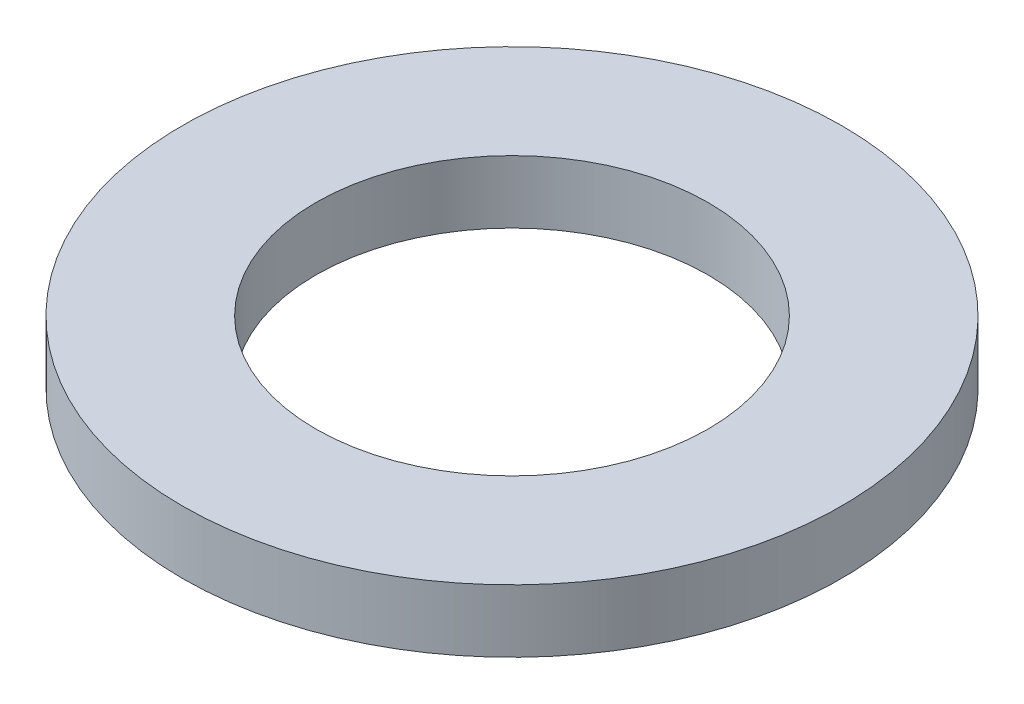
ISO-10303-21;
HEADER;
FILE_DESCRIPTION(('STEP AP214'),'2;1');
FILE_NAME('part.step','',(''),(''),'','','');
FILE_SCHEMA(('AUTOMOTIVE_DESIGN { 1 0 10303 214 1 1 1 1 }'));
ENDSEC;
DATA;
#1=APPLICATION_CONTEXT('core data for automotive mechanical design processes');
#2=APPLICATION_PROTOCOL_DEFINITION('international standard','automotive_design',2000,#1);
#3=PRODUCT_CONTEXT('',#1,'mechanical');
#4=PRODUCT('Part','Part','',(#3));
#5=PRODUCT_RELATED_PRODUCT_CATEGORY('part','',(#4));
#6=PRODUCT_DEFINITION_FORMATION('','',#4);
#7=PRODUCT_DEFINITION_CONTEXT('part definition',#1,'design');
#8=PRODUCT_DEFINITION('design','',#6,#7);
#9=PRODUCT_DEFINITION_SHAPE('','',#8);
#10=(LENGTH_UNIT() NAMED_UNIT(*) SI_UNIT(.MILLI.,.METRE.));
#11=(NAMED_UNIT(*) PLANE_ANGLE_UNIT() SI_UNIT($,.RADIAN.));
#12=(NAMED_UNIT(*) SI_UNIT($,.STERADIAN.) SOLID_ANGLE_UNIT());
#13=UNCERTAINTY_MEASURE_WITH_UNIT(LENGTH_MEASURE(1.E-05),#10,'distance_accuracy_value','');
#14=(GEOMETRIC_REPRESENTATION_CONTEXT(3) GLOBAL_UNCERTAINTY_ASSIGNED_CONTEXT((#13)) GLOBAL_UNIT_ASSIGNED_CONTEXT((#10,
#11,#12)) REPRESENTATION_CONTEXT('',''));
#15=CARTESIAN_POINT('',(0.,0.,0.));
#16=DIRECTION('',(0.,0.,1.));
#17=DIRECTION('',(1.,0.,0.));
#18=AXIS2_PLACEMENT_3D('',#15,#16,#17);
#19=CARTESIAN_POINT('',(0.,4.,0.));
#20=DIRECTION('',(0.,1.,0.));
#21=DIRECTION('',(0.,0.,1.));
#22=AXIS2_PLACEMENT_3D('',#19,#20,#21);
#23=PLANE('',#22);
#24=CARTESIAN_POINT('',(0.,4.,0.));
#25=DIRECTION('',(0.,1.,0.));
#26=DIRECTION('',(0.,0.,1.));
#27=AXIS2_PLACEMENT_3D('',#24,#25,#26);
#28=CIRCLE('',#27,21.);
#29=CARTESIAN_POINT('',(0.,4.,21.));
#30=VERTEX_POINT('',#29);
#31=EDGE_CURVE('E10',#30,#30,#28,.T.);
#32=ORIENTED_EDGE('',*,*,#31,.T.);
#33=EDGE_LOOP('',(#32));
#34=FACE_BOUND('',#33,.T.);
#35=CARTESIAN_POINT('',(0.,4.,0.));
#36=DIRECTION('',(0.,1.,0.));
#37=DIRECTION('',(0.,0.,1.));
#38=AXIS2_PLACEMENT_3D('',#35,#36,#37);
#39=CIRCLE('',#38,12.5);
#40=CARTESIAN_POINT('',(0.,4.,12.5));
#41=VERTEX_POINT('',#40);
#42=EDGE_CURVE('E54',#41,#41,#39,.T.);
#43=ORIENTED_EDGE('',*,*,#42,.F.);
#44=EDGE_LOOP('',(#43));
#45=FACE_BOUND('',#44,.T.);
#46=ADVANCED_FACE('F41',(#34,#45),#23,.T.);
#47=CARTESIAN_POINT('',(0.,0.,0.));
#48=DIRECTION('',(0.,1.,0.));
#49=DIRECTION('',(0.,0.,1.));
#50=AXIS2_PLACEMENT_3D('',#47,#48,#49);
#51=PLANE('',#50);
#52=CARTESIAN_POINT('',(0.,0.,0.));
#53=DIRECTION('',(0.,1.,0.));
#54=DIRECTION('',(0.,0.,1.));
#55=AXIS2_PLACEMENT_3D('',#52,#53,#54);
#56=CIRCLE('',#55,21.);
#57=CARTESIAN_POINT('',(0.,0.,21.));
#58=VERTEX_POINT('',#57);
#59=EDGE_CURVE('E45',#58,#58,#56,.T.);
#60=ORIENTED_EDGE('',*,*,#59,.F.);
#61=EDGE_LOOP('',(#60));
#62=FACE_BOUND('',#61,.T.);
#63=CARTESIAN_POINT('',(0.,0.,0.));
#64=DIRECTION('',(0.,1.,0.));
#65=DIRECTION('',(0.,0.,1.));
#66=AXIS2_PLACEMENT_3D('',#63,#64,#65);
#67=CIRCLE('',#66,12.5);
#68=CARTESIAN_POINT('',(0.,0.,12.5));
#69=VERTEX_POINT('',#68);
#70=EDGE_CURVE('E56',#69,#69,#67,.T.);
#71=ORIENTED_EDGE('',*,*,#70,.T.);
#72=EDGE_LOOP('',(#71));
#73=FACE_BOUND('',#72,.T.);
#74=ADVANCED_FACE('F68',(#62,#73),#51,.F.);
#75=CARTESIAN_POINT('',(0.,4.,0.));
#76=DIRECTION('',(0.,-1.,0.));
#77=DIRECTION('',(0.,0.,-1.));
#78=AXIS2_PLACEMENT_3D('',#75,#76,#77);
#79=CYLINDRICAL_SURFACE('',#78,21.);
#80=ORIENTED_EDGE('',*,*,#31,.F.);
#81=EDGE_LOOP('',(#80));
#82=FACE_BOUND('',#81,.T.);
#83=ORIENTED_EDGE('',*,*,#59,.T.);
#84=EDGE_LOOP('',(#83));
#85=FACE_BOUND('',#84,.T.);
#86=ADVANCED_FACE('F43',(#82,#85),#79,.T.);
#87=CARTESIAN_POINT('',(0.,4.,0.));
#88=DIRECTION('',(0.,-1.,0.));
#89=DIRECTION('',(0.,0.,-1.));
#90=AXIS2_PLACEMENT_3D('',#87,#88,#89);
#91=CYLINDRICAL_SURFACE('',#90,12.5);
#92=ORIENTED_EDGE('',*,*,#42,.T.);
#93=EDGE_LOOP('',(#92));
#94=FACE_BOUND('',#93,.T.);
#95=ORIENTED_EDGE('',*,*,#70,.F.);
#96=EDGE_LOOP('',(#95));
#97=FACE_BOUND('',#96,.T.);
#98=ADVANCED_FACE('F64',(#94,#97),#91,.F.);
#99=CLOSED_SHELL('',(#46,#74,#86,#98));
#100=MANIFOLD_SOLID_BREP('B2',#99);
#101=ADVANCED_BREP_SHAPE_REPRESENTATION('',(#18,#100),#14);
#102=SHAPE_DEFINITION_REPRESENTATION(#9,#101);
ENDSEC;
END-ISO-10303-21;
